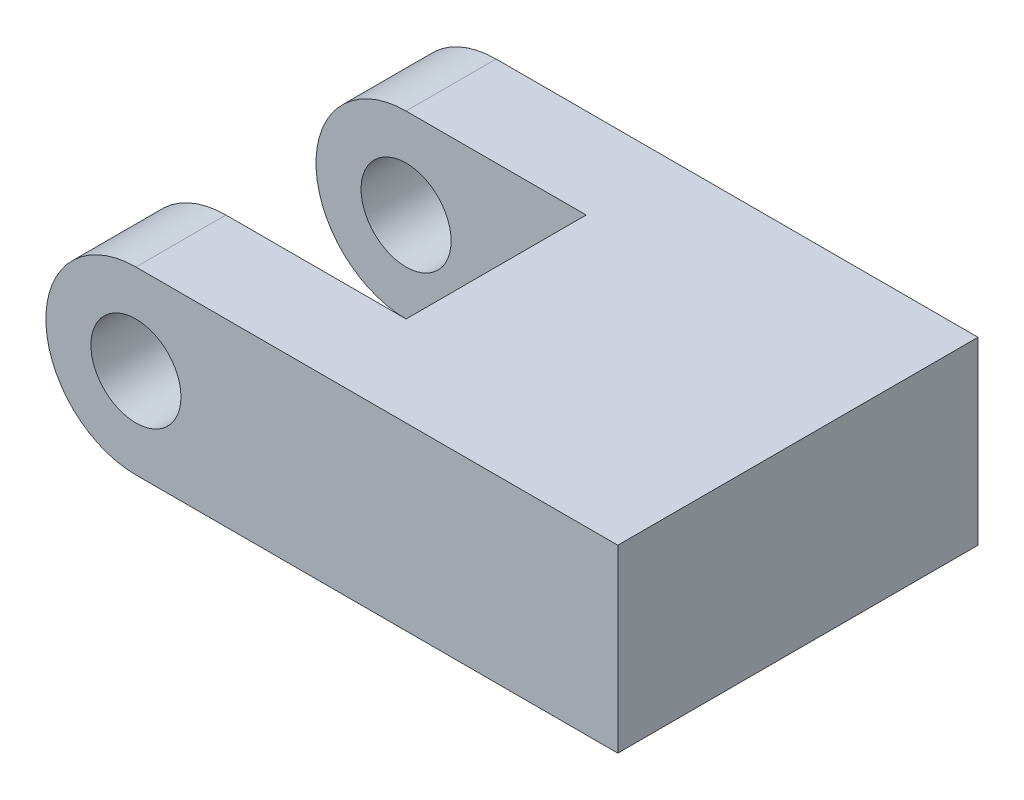
ISO-10303-21;
HEADER;
FILE_DESCRIPTION(('STEP AP214'),'2;1');
FILE_NAME('part.step','',(''),(''),'','','');
FILE_SCHEMA(('AUTOMOTIVE_DESIGN { 1 0 10303 214 1 1 1 1 }'));
ENDSEC;
DATA;
#1=APPLICATION_CONTEXT('core data for automotive mechanical design processes');
#2=APPLICATION_PROTOCOL_DEFINITION('international standard','automotive_design',2000,#1);
#3=PRODUCT_CONTEXT('',#1,'mechanical');
#4=PRODUCT('Part','Part','',(#3));
#5=PRODUCT_RELATED_PRODUCT_CATEGORY('part','',(#4));
#6=PRODUCT_DEFINITION_FORMATION('','',#4);
#7=PRODUCT_DEFINITION_CONTEXT('part definition',#1,'design');
#8=PRODUCT_DEFINITION('design','',#6,#7);
#9=PRODUCT_DEFINITION_SHAPE('','',#8);
#10=(LENGTH_UNIT() NAMED_UNIT(*) SI_UNIT(.MILLI.,.METRE.));
#11=(NAMED_UNIT(*) PLANE_ANGLE_UNIT() SI_UNIT($,.RADIAN.));
#12=(NAMED_UNIT(*) SI_UNIT($,.STERADIAN.) SOLID_ANGLE_UNIT());
#13=UNCERTAINTY_MEASURE_WITH_UNIT(LENGTH_MEASURE(1.E-05),#10,'distance_accuracy_value','');
#14=(GEOMETRIC_REPRESENTATION_CONTEXT(3) GLOBAL_UNCERTAINTY_ASSIGNED_CONTEXT((#13)) GLOBAL_UNIT_ASSIGNED_CONTEXT((#10,
#11,#12)) REPRESENTATION_CONTEXT('',''));
#15=CARTESIAN_POINT('',(0.,0.,0.));
#16=DIRECTION('',(0.,0.,1.));
#17=DIRECTION('',(1.,0.,0.));
#18=AXIS2_PLACEMENT_3D('',#15,#16,#17);
#19=CARTESIAN_POINT('',(0.,10.,40.));
#20=DIRECTION('',(0.,1.,0.));
#21=DIRECTION('',(0.,0.,1.));
#22=AXIS2_PLACEMENT_3D('',#19,#20,#21);
#23=PLANE('',#22);
#24=DIRECTION('',(0.,0.,1.));
#25=VECTOR('',#24,1.);
#26=CARTESIAN_POINT('',(20.,10.,40.));
#27=LINE('',#26,#25);
#28=CARTESIAN_POINT('',(20.,10.,10.));
#29=VERTEX_POINT('',#28);
#30=CARTESIAN_POINT('',(20.,10.,30.));
#31=VERTEX_POINT('',#30);
#32=EDGE_CURVE('E121',#29,#31,#27,.T.);
#33=ORIENTED_EDGE('',*,*,#32,.T.);
#34=DIRECTION('',(-1.,0.,0.));
#35=VECTOR('',#34,1.);
#36=CARTESIAN_POINT('',(0.,10.,30.));
#37=LINE('',#36,#35);
#38=CARTESIAN_POINT('',(0.,10.,30.));
#39=VERTEX_POINT('',#38);
#40=EDGE_CURVE('E111',#31,#39,#37,.T.);
#41=ORIENTED_EDGE('',*,*,#40,.T.);
#42=DIRECTION('',(0.,0.,-1.));
#43=VECTOR('',#42,1.);
#44=CARTESIAN_POINT('',(0.,10.,40.));
#45=LINE('',#44,#43);
#46=CARTESIAN_POINT('',(0.,10.,40.));
#47=VERTEX_POINT('',#46);
#48=EDGE_CURVE('E88',#47,#39,#45,.T.);
#49=ORIENTED_EDGE('',*,*,#48,.F.);
#50=DIRECTION('',(1.,0.,0.));
#51=VECTOR('',#50,1.);
#52=CARTESIAN_POINT('',(0.,10.,40.));
#53=LINE('',#52,#51);
#54=CARTESIAN_POINT('',(53.512258846341,10.,40.));
#55=VERTEX_POINT('',#54);
#56=EDGE_CURVE('E136',#47,#55,#53,.T.);
#57=ORIENTED_EDGE('',*,*,#56,.T.);
#58=DIRECTION('',(0.,0.,-1.));
#59=VECTOR('',#58,1.);
#60=CARTESIAN_POINT('',(53.512258846341,10.,40.));
#61=LINE('',#60,#59);
#62=CARTESIAN_POINT('',(53.512258846341,10.,0.));
#63=VERTEX_POINT('',#62);
#64=EDGE_CURVE('E63',#55,#63,#61,.T.);
#65=ORIENTED_EDGE('',*,*,#64,.T.);
#66=DIRECTION('',(1.,0.,0.));
#67=VECTOR('',#66,1.);
#68=CARTESIAN_POINT('',(0.,10.,0.));
#69=LINE('',#68,#67);
#70=CARTESIAN_POINT('',(0.,10.,0.));
#71=VERTEX_POINT('',#70);
#72=EDGE_CURVE('E118',#71,#63,#69,.T.);
#73=ORIENTED_EDGE('',*,*,#72,.F.);
#74=CARTESIAN_POINT('',(0.,10.,10.));
#75=VERTEX_POINT('',#74);
#76=EDGE_CURVE('E162',#75,#71,#45,.T.);
#77=ORIENTED_EDGE('',*,*,#76,.F.);
#78=DIRECTION('',(1.,0.,0.));
#79=VECTOR('',#78,1.);
#80=CARTESIAN_POINT('',(0.,10.,10.));
#81=LINE('',#80,#79);
#82=EDGE_CURVE('E128',#75,#29,#81,.T.);
#83=ORIENTED_EDGE('',*,*,#82,.T.);
#84=EDGE_LOOP('',(#33,#41,#49,#57,#65,#73,#77,#83));
#85=FACE_BOUND('',#84,.T.);
#86=ADVANCED_FACE('F39',(#85),#23,.T.);
#87=CARTESIAN_POINT('',(0.,0.,40.));
#88=DIRECTION('',(0.,0.,-1.));
#89=DIRECTION('',(-1.,0.,0.));
#90=AXIS2_PLACEMENT_3D('',#87,#88,#89);
#91=CYLINDRICAL_SURFACE('',#90,10.);
#92=CARTESIAN_POINT('',(0.,0.,30.));
#93=DIRECTION('',(0.,0.,-1.));
#94=DIRECTION('',(0.,1.,0.));
#95=AXIS2_PLACEMENT_3D('',#92,#93,#94);
#96=CIRCLE('',#95,10.);
#97=CARTESIAN_POINT('',(0.,-10.,30.));
#98=VERTEX_POINT('',#97);
#99=EDGE_CURVE('E116',#98,#39,#96,.T.);
#100=ORIENTED_EDGE('',*,*,#99,.F.);
#101=DIRECTION('',(0.,0.,-1.));
#102=VECTOR('',#101,1.);
#103=CARTESIAN_POINT('',(0.,-10.,40.));
#104=LINE('',#103,#102);
#105=CARTESIAN_POINT('',(0.,-10.,40.));
#106=VERTEX_POINT('',#105);
#107=EDGE_CURVE('E159',#106,#98,#104,.T.);
#108=ORIENTED_EDGE('',*,*,#107,.F.);
#109=CARTESIAN_POINT('',(0.,0.,40.));
#110=DIRECTION('',(0.,0.,1.));
#111=DIRECTION('',(1.,0.,0.));
#112=AXIS2_PLACEMENT_3D('',#109,#110,#111);
#113=CIRCLE('',#112,10.);
#114=EDGE_CURVE('E138',#47,#106,#113,.T.);
#115=ORIENTED_EDGE('',*,*,#114,.F.);
#116=ORIENTED_EDGE('',*,*,#48,.T.);
#117=EDGE_LOOP('',(#100,#108,#115,#116));
#118=FACE_BOUND('',#117,.T.);
#119=ADVANCED_FACE('F195',(#118),#91,.T.);
#120=CARTESIAN_POINT('',(0.,0.,10.));
#121=DIRECTION('',(0.,0.,1.));
#122=DIRECTION('',(0.,-1.,0.));
#123=AXIS2_PLACEMENT_3D('',#120,#121,#122);
#124=CIRCLE('',#123,10.);
#125=CARTESIAN_POINT('',(0.,-10.,10.));
#126=VERTEX_POINT('',#125);
#127=EDGE_CURVE('E129',#75,#126,#124,.T.);
#128=ORIENTED_EDGE('',*,*,#127,.F.);
#129=ORIENTED_EDGE('',*,*,#76,.T.);
#130=CARTESIAN_POINT('',(0.,0.,0.));
#131=DIRECTION('',(0.,0.,1.));
#132=DIRECTION('',(1.,0.,0.));
#133=AXIS2_PLACEMENT_3D('',#130,#131,#132);
#134=CIRCLE('',#133,10.);
#135=CARTESIAN_POINT('',(0.,-10.,0.));
#136=VERTEX_POINT('',#135);
#137=EDGE_CURVE('E147',#71,#136,#134,.T.);
#138=ORIENTED_EDGE('',*,*,#137,.T.);
#139=EDGE_CURVE('E158',#126,#136,#104,.T.);
#140=ORIENTED_EDGE('',*,*,#139,.F.);
#141=EDGE_LOOP('',(#128,#129,#138,#140));
#142=FACE_BOUND('',#141,.T.);
#143=ADVANCED_FACE('F173',(#142),#91,.T.);
#144=CARTESIAN_POINT('',(0.,-10.,40.));
#145=DIRECTION('',(0.,-1.,0.));
#146=DIRECTION('',(0.,0.,-1.));
#147=AXIS2_PLACEMENT_3D('',#144,#145,#146);
#148=PLANE('',#147);
#149=ORIENTED_EDGE('',*,*,#107,.T.);
#150=DIRECTION('',(1.,0.,0.));
#151=VECTOR('',#150,1.);
#152=CARTESIAN_POINT('',(0.,-10.,30.));
#153=LINE('',#152,#151);
#154=CARTESIAN_POINT('',(20.,-9.99999999999999,30.));
#155=VERTEX_POINT('',#154);
#156=EDGE_CURVE('E11',#98,#155,#153,.T.);
#157=ORIENTED_EDGE('',*,*,#156,.T.);
#158=DIRECTION('',(0.,0.,-1.));
#159=VECTOR('',#158,1.);
#160=CARTESIAN_POINT('',(20.,-10.,40.));
#161=LINE('',#160,#159);
#162=CARTESIAN_POINT('',(20.,-10.,10.));
#163=VERTEX_POINT('',#162);
#164=EDGE_CURVE('E123',#155,#163,#161,.T.);
#165=ORIENTED_EDGE('',*,*,#164,.T.);
#166=DIRECTION('',(-1.,0.,0.));
#167=VECTOR('',#166,1.);
#168=CARTESIAN_POINT('',(0.,-10.,10.));
#169=LINE('',#168,#167);
#170=EDGE_CURVE('E47',#163,#126,#169,.T.);
#171=ORIENTED_EDGE('',*,*,#170,.T.);
#172=ORIENTED_EDGE('',*,*,#139,.T.);
#173=DIRECTION('',(-1.,0.,0.));
#174=VECTOR('',#173,1.);
#175=CARTESIAN_POINT('',(0.,-10.,0.));
#176=LINE('',#175,#174);
#177=CARTESIAN_POINT('',(53.512258846341,-10.,0.));
#178=VERTEX_POINT('',#177);
#179=EDGE_CURVE('E150',#178,#136,#176,.T.);
#180=ORIENTED_EDGE('',*,*,#179,.F.);
#181=DIRECTION('',(0.,0.,-1.));
#182=VECTOR('',#181,1.);
#183=CARTESIAN_POINT('',(53.512258846341,-10.,40.));
#184=LINE('',#183,#182);
#185=CARTESIAN_POINT('',(53.512258846341,-10.,40.));
#186=VERTEX_POINT('',#185);
#187=EDGE_CURVE('E156',#186,#178,#184,.T.);
#188=ORIENTED_EDGE('',*,*,#187,.F.);
#189=DIRECTION('',(-1.,0.,0.));
#190=VECTOR('',#189,1.);
#191=CARTESIAN_POINT('',(0.,-10.,40.));
#192=LINE('',#191,#190);
#193=EDGE_CURVE('E141',#186,#106,#192,.T.);
#194=ORIENTED_EDGE('',*,*,#193,.T.);
#195=EDGE_LOOP('',(#149,#157,#165,#171,#172,#180,#188,#194));
#196=FACE_BOUND('',#195,.T.);
#197=ADVANCED_FACE('F168',(#196),#148,.T.);
#198=CARTESIAN_POINT('',(53.512258846341,0.,40.));
#199=DIRECTION('',(1.,0.,0.));
#200=DIRECTION('',(0.,0.,-1.));
#201=AXIS2_PLACEMENT_3D('',#198,#199,#200);
#202=PLANE('',#201);
#203=DIRECTION('',(0.,-1.,0.));
#204=VECTOR('',#203,1.);
#205=CARTESIAN_POINT('',(53.512258846341,0.,0.));
#206=LINE('',#205,#204);
#207=EDGE_CURVE('E139',#63,#178,#206,.T.);
#208=ORIENTED_EDGE('',*,*,#207,.F.);
#209=ORIENTED_EDGE('',*,*,#64,.F.);
#210=DIRECTION('',(0.,-1.,0.));
#211=VECTOR('',#210,1.);
#212=CARTESIAN_POINT('',(53.512258846341,0.,40.));
#213=LINE('',#212,#211);
#214=EDGE_CURVE('E144',#55,#186,#213,.T.);
#215=ORIENTED_EDGE('',*,*,#214,.T.);
#216=ORIENTED_EDGE('',*,*,#187,.T.);
#217=EDGE_LOOP('',(#208,#209,#215,#216));
#218=FACE_BOUND('',#217,.T.);
#219=ADVANCED_FACE('F183',(#218),#202,.T.);
#220=CARTESIAN_POINT('',(0.,0.,40.));
#221=DIRECTION('',(0.,0.,1.));
#222=DIRECTION('',(1.,0.,0.));
#223=AXIS2_PLACEMENT_3D('',#220,#221,#222);
#224=PLANE('',#223);
#225=CARTESIAN_POINT('',(0.,0.,40.));
#226=DIRECTION('',(0.,0.,1.));
#227=DIRECTION('',(1.,0.,0.));
#228=AXIS2_PLACEMENT_3D('',#225,#226,#227);
#229=CIRCLE('',#228,5.);
#230=CARTESIAN_POINT('',(5.,0.,40.));
#231=VERTEX_POINT('',#230);
#232=EDGE_CURVE('E281',#231,#231,#229,.T.);
#233=ORIENTED_EDGE('',*,*,#232,.F.);
#234=EDGE_LOOP('',(#233));
#235=FACE_BOUND('',#234,.T.);
#236=ORIENTED_EDGE('',*,*,#56,.F.);
#237=ORIENTED_EDGE('',*,*,#114,.T.);
#238=ORIENTED_EDGE('',*,*,#193,.F.);
#239=ORIENTED_EDGE('',*,*,#214,.F.);
#240=EDGE_LOOP('',(#236,#237,#238,#239));
#241=FACE_BOUND('',#240,.T.);
#242=ADVANCED_FACE('F181',(#235,#241),#224,.T.);
#243=CARTESIAN_POINT('',(0.,0.,0.));
#244=DIRECTION('',(0.,0.,1.));
#245=DIRECTION('',(1.,0.,0.));
#246=AXIS2_PLACEMENT_3D('',#243,#244,#245);
#247=PLANE('',#246);
#248=CARTESIAN_POINT('',(0.,0.,0.));
#249=DIRECTION('',(0.,0.,1.));
#250=DIRECTION('',(1.,0.,0.));
#251=AXIS2_PLACEMENT_3D('',#248,#249,#250);
#252=CIRCLE('',#251,5.);
#253=CARTESIAN_POINT('',(5.,0.,0.));
#254=VERTEX_POINT('',#253);
#255=EDGE_CURVE('E282',#254,#254,#252,.T.);
#256=ORIENTED_EDGE('',*,*,#255,.T.);
#257=EDGE_LOOP('',(#256));
#258=FACE_BOUND('',#257,.T.);
#259=ORIENTED_EDGE('',*,*,#72,.T.);
#260=ORIENTED_EDGE('',*,*,#207,.T.);
#261=ORIENTED_EDGE('',*,*,#179,.T.);
#262=ORIENTED_EDGE('',*,*,#137,.F.);
#263=EDGE_LOOP('',(#259,#260,#261,#262));
#264=FACE_BOUND('',#263,.T.);
#265=ADVANCED_FACE('F176',(#258,#264),#247,.F.);
#266=CARTESIAN_POINT('',(20.,14.4723911812518,30.));
#267=DIRECTION('',(0.,0.,-1.));
#268=DIRECTION('',(0.,1.,0.));
#269=AXIS2_PLACEMENT_3D('',#266,#267,#268);
#270=PLANE('',#269);
#271=CARTESIAN_POINT('',(0.,0.,30.));
#272=DIRECTION('',(0.,0.,-1.));
#273=DIRECTION('',(0.,1.,0.));
#274=AXIS2_PLACEMENT_3D('',#271,#272,#273);
#275=CIRCLE('',#274,5.);
#276=CARTESIAN_POINT('',(0.,5.,30.));
#277=VERTEX_POINT('',#276);
#278=EDGE_CURVE('E124',#277,#277,#275,.T.);
#279=ORIENTED_EDGE('',*,*,#278,.F.);
#280=EDGE_LOOP('',(#279));
#281=FACE_BOUND('',#280,.T.);
#282=DIRECTION('',(0.,-1.,0.));
#283=VECTOR('',#282,1.);
#284=CARTESIAN_POINT('',(20.,14.4723911812518,30.));
#285=LINE('',#284,#283);
#286=EDGE_CURVE('E114',#31,#155,#285,.T.);
#287=ORIENTED_EDGE('',*,*,#286,.T.);
#288=ORIENTED_EDGE('',*,*,#156,.F.);
#289=ORIENTED_EDGE('',*,*,#99,.T.);
#290=ORIENTED_EDGE('',*,*,#40,.F.);
#291=EDGE_LOOP('',(#287,#288,#289,#290));
#292=FACE_BOUND('',#291,.T.);
#293=ADVANCED_FACE('F113',(#281,#292),#270,.T.);
#294=CARTESIAN_POINT('',(20.,14.4723911812518,10.));
#295=DIRECTION('',(0.,0.,1.));
#296=DIRECTION('',(0.,-1.,0.));
#297=AXIS2_PLACEMENT_3D('',#294,#295,#296);
#298=PLANE('',#297);
#299=CARTESIAN_POINT('',(0.,0.,10.));
#300=DIRECTION('',(0.,0.,1.));
#301=DIRECTION('',(0.,-1.,0.));
#302=AXIS2_PLACEMENT_3D('',#299,#300,#301);
#303=CIRCLE('',#302,5.);
#304=CARTESIAN_POINT('',(0.,-5.,10.));
#305=VERTEX_POINT('',#304);
#306=EDGE_CURVE('E42',#305,#305,#303,.T.);
#307=ORIENTED_EDGE('',*,*,#306,.F.);
#308=EDGE_LOOP('',(#307));
#309=FACE_BOUND('',#308,.T.);
#310=ORIENTED_EDGE('',*,*,#127,.T.);
#311=ORIENTED_EDGE('',*,*,#170,.F.);
#312=DIRECTION('',(0.,1.,0.));
#313=VECTOR('',#312,1.);
#314=CARTESIAN_POINT('',(20.,14.4723911812518,10.));
#315=LINE('',#314,#313);
#316=EDGE_CURVE('E54',#163,#29,#315,.T.);
#317=ORIENTED_EDGE('',*,*,#316,.T.);
#318=ORIENTED_EDGE('',*,*,#82,.F.);
#319=EDGE_LOOP('',(#310,#311,#317,#318));
#320=FACE_BOUND('',#319,.T.);
#321=ADVANCED_FACE('F220',(#309,#320),#298,.T.);
#322=CARTESIAN_POINT('',(20.,0.,0.));
#323=DIRECTION('',(-1.,0.,0.));
#324=DIRECTION('',(0.,0.,1.));
#325=AXIS2_PLACEMENT_3D('',#322,#323,#324);
#326=PLANE('',#325);
#327=ORIENTED_EDGE('',*,*,#316,.F.);
#328=ORIENTED_EDGE('',*,*,#164,.F.);
#329=ORIENTED_EDGE('',*,*,#286,.F.);
#330=ORIENTED_EDGE('',*,*,#32,.F.);
#331=EDGE_LOOP('',(#327,#328,#329,#330));
#332=FACE_BOUND('',#331,.T.);
#333=ADVANCED_FACE('F120',(#332),#326,.T.);
#334=CARTESIAN_POINT('',(0.,0.,0.));
#335=DIRECTION('',(0.,0.,1.));
#336=DIRECTION('',(1.,0.,0.));
#337=AXIS2_PLACEMENT_3D('',#334,#335,#336);
#338=CYLINDRICAL_SURFACE('',#337,5.);
#339=ORIENTED_EDGE('',*,*,#306,.T.);
#340=EDGE_LOOP('',(#339));
#341=FACE_BOUND('',#340,.T.);
#342=ORIENTED_EDGE('',*,*,#255,.F.);
#343=EDGE_LOOP('',(#342));
#344=FACE_BOUND('',#343,.T.);
#345=ADVANCED_FACE('F219',(#341,#344),#338,.F.);
#346=ORIENTED_EDGE('',*,*,#278,.T.);
#347=EDGE_LOOP('',(#346));
#348=FACE_BOUND('',#347,.T.);
#349=ORIENTED_EDGE('',*,*,#232,.T.);
#350=EDGE_LOOP('',(#349));
#351=FACE_BOUND('',#350,.T.);
#352=ADVANCED_FACE('F263',(#348,#351),#338,.F.);
#353=CLOSED_SHELL('',(#86,#119,#143,#197,#219,#242,#265,#293,#321,#333,#345,#352));
#354=MANIFOLD_SOLID_BREP('B2',#353);
#355=ADVANCED_BREP_SHAPE_REPRESENTATION('',(#18,#354),#14);
#356=SHAPE_DEFINITION_REPRESENTATION(#9,#355);
ENDSEC;
END-ISO-10303-21;
